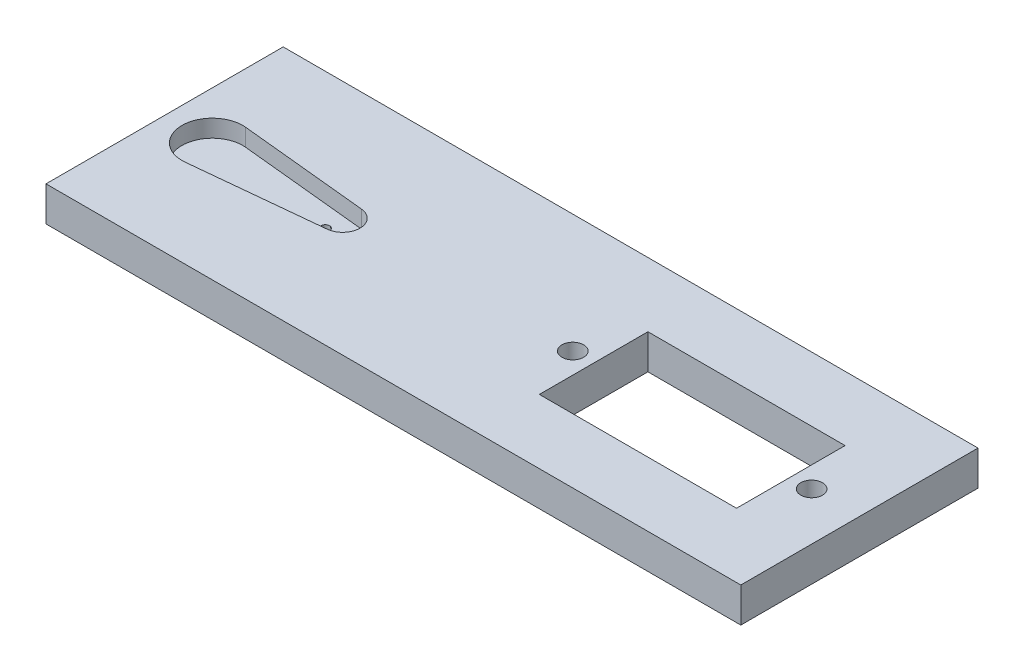
ISO-10303-21;
HEADER;
FILE_DESCRIPTION(('STEP AP214'),'2;1');
FILE_NAME('part.step','',(''),(''),'','','');
FILE_SCHEMA(('AUTOMOTIVE_DESIGN { 1 0 10303 214 1 1 1 1 }'));
ENDSEC;
DATA;
#1=APPLICATION_CONTEXT('core data for automotive mechanical design processes');
#2=APPLICATION_PROTOCOL_DEFINITION('international standard','automotive_design',2000,#1);
#3=PRODUCT_CONTEXT('',#1,'mechanical');
#4=PRODUCT('Part','Part','',(#3));
#5=PRODUCT_RELATED_PRODUCT_CATEGORY('part','',(#4));
#6=PRODUCT_DEFINITION_FORMATION('','',#4);
#7=PRODUCT_DEFINITION_CONTEXT('part definition',#1,'design');
#8=PRODUCT_DEFINITION('design','',#6,#7);
#9=PRODUCT_DEFINITION_SHAPE('','',#8);
#10=(LENGTH_UNIT() NAMED_UNIT(*) SI_UNIT(.MILLI.,.METRE.));
#11=(NAMED_UNIT(*) PLANE_ANGLE_UNIT() SI_UNIT($,.RADIAN.));
#12=(NAMED_UNIT(*) SI_UNIT($,.STERADIAN.) SOLID_ANGLE_UNIT());
#13=UNCERTAINTY_MEASURE_WITH_UNIT(LENGTH_MEASURE(1.E-05),#10,'distance_accuracy_value','');
#14=(GEOMETRIC_REPRESENTATION_CONTEXT(3) GLOBAL_UNCERTAINTY_ASSIGNED_CONTEXT((#13)) GLOBAL_UNIT_ASSIGNED_CONTEXT((#10,
#11,#12)) REPRESENTATION_CONTEXT('',''));
#15=CARTESIAN_POINT('',(0.,0.,0.));
#16=DIRECTION('',(0.,0.,1.));
#17=DIRECTION('',(1.,0.,0.));
#18=AXIS2_PLACEMENT_3D('',#15,#16,#17);
#19=CARTESIAN_POINT('',(0.,4.,-6.25));
#20=DIRECTION('',(0.,0.,-1.));
#21=DIRECTION('',(-1.,0.,0.));
#22=AXIS2_PLACEMENT_3D('',#19,#20,#21);
#23=PLANE('',#22);
#24=DIRECTION('',(1.,0.,0.));
#25=VECTOR('',#24,1.);
#26=CARTESIAN_POINT('',(0.,0.,-6.25));
#27=LINE('',#26,#25);
#28=CARTESIAN_POINT('',(9.40000000000002,0.,-6.25));
#29=VERTEX_POINT('',#28);
#30=CARTESIAN_POINT('',(32.1,0.,-6.25));
#31=VERTEX_POINT('',#30);
#32=EDGE_CURVE('E197',#29,#31,#27,.T.);
#33=ORIENTED_EDGE('',*,*,#32,.T.);
#34=DIRECTION('',(0.,-1.,0.));
#35=VECTOR('',#34,1.);
#36=CARTESIAN_POINT('',(32.1,4.,-6.25));
#37=LINE('',#36,#35);
#38=CARTESIAN_POINT('',(32.1,4.,-6.25));
#39=VERTEX_POINT('',#38);
#40=EDGE_CURVE('E11',#39,#31,#37,.T.);
#41=ORIENTED_EDGE('',*,*,#40,.F.);
#42=DIRECTION('',(1.,0.,0.));
#43=VECTOR('',#42,1.);
#44=CARTESIAN_POINT('',(0.,4.,-6.25));
#45=LINE('',#44,#43);
#46=CARTESIAN_POINT('',(9.40000000000002,4.,-6.25));
#47=VERTEX_POINT('',#46);
#48=EDGE_CURVE('E149',#47,#39,#45,.T.);
#49=ORIENTED_EDGE('',*,*,#48,.F.);
#50=DIRECTION('',(0.,-1.,0.));
#51=VECTOR('',#50,1.);
#52=CARTESIAN_POINT('',(9.40000000000002,4.,-6.25));
#53=LINE('',#52,#51);
#54=EDGE_CURVE('E74',#47,#29,#53,.T.);
#55=ORIENTED_EDGE('',*,*,#54,.T.);
#56=EDGE_LOOP('',(#33,#41,#49,#55));
#57=FACE_BOUND('',#56,.T.);
#58=ADVANCED_FACE('F47',(#57),#23,.F.);
#59=CARTESIAN_POINT('',(32.1,4.,0.));
#60=DIRECTION('',(1.,0.,0.));
#61=DIRECTION('',(0.,0.,-1.));
#62=AXIS2_PLACEMENT_3D('',#59,#60,#61);
#63=PLANE('',#62);
#64=DIRECTION('',(0.,0.,1.));
#65=VECTOR('',#64,1.);
#66=CARTESIAN_POINT('',(32.1,0.,0.));
#67=LINE('',#66,#65);
#68=CARTESIAN_POINT('',(32.1,0.,6.25));
#69=VERTEX_POINT('',#68);
#70=EDGE_CURVE('E156',#31,#69,#67,.T.);
#71=ORIENTED_EDGE('',*,*,#70,.T.);
#72=DIRECTION('',(0.,-1.,0.));
#73=VECTOR('',#72,1.);
#74=CARTESIAN_POINT('',(32.1,4.,6.25));
#75=LINE('',#74,#73);
#76=CARTESIAN_POINT('',(32.1,4.,6.25));
#77=VERTEX_POINT('',#76);
#78=EDGE_CURVE('E57',#77,#69,#75,.T.);
#79=ORIENTED_EDGE('',*,*,#78,.F.);
#80=DIRECTION('',(0.,0.,1.));
#81=VECTOR('',#80,1.);
#82=CARTESIAN_POINT('',(32.1,4.,0.));
#83=LINE('',#82,#81);
#84=EDGE_CURVE('E143',#39,#77,#83,.T.);
#85=ORIENTED_EDGE('',*,*,#84,.F.);
#86=ORIENTED_EDGE('',*,*,#40,.T.);
#87=EDGE_LOOP('',(#71,#79,#85,#86));
#88=FACE_BOUND('',#87,.T.);
#89=ADVANCED_FACE('F155',(#88),#63,.F.);
#90=CARTESIAN_POINT('',(0.,4.,6.25));
#91=DIRECTION('',(0.,0.,-1.));
#92=DIRECTION('',(-1.,0.,0.));
#93=AXIS2_PLACEMENT_3D('',#90,#91,#92);
#94=PLANE('',#93);
#95=DIRECTION('',(1.,0.,0.));
#96=VECTOR('',#95,1.);
#97=CARTESIAN_POINT('',(0.,0.,6.25));
#98=LINE('',#97,#96);
#99=CARTESIAN_POINT('',(9.40000000000002,0.,6.25));
#100=VERTEX_POINT('',#99);
#101=EDGE_CURVE('E202',#100,#69,#98,.T.);
#102=ORIENTED_EDGE('',*,*,#101,.F.);
#103=DIRECTION('',(0.,-1.,0.));
#104=VECTOR('',#103,1.);
#105=CARTESIAN_POINT('',(9.40000000000002,4.,6.25));
#106=LINE('',#105,#104);
#107=CARTESIAN_POINT('',(9.40000000000002,4.,6.25));
#108=VERTEX_POINT('',#107);
#109=EDGE_CURVE('E161',#108,#100,#106,.T.);
#110=ORIENTED_EDGE('',*,*,#109,.F.);
#111=DIRECTION('',(1.,0.,0.));
#112=VECTOR('',#111,1.);
#113=CARTESIAN_POINT('',(0.,4.,6.25));
#114=LINE('',#113,#112);
#115=EDGE_CURVE('E148',#108,#77,#114,.T.);
#116=ORIENTED_EDGE('',*,*,#115,.T.);
#117=ORIENTED_EDGE('',*,*,#78,.T.);
#118=EDGE_LOOP('',(#102,#110,#116,#117));
#119=FACE_BOUND('',#118,.T.);
#120=ADVANCED_FACE('F163',(#119),#94,.T.);
#121=CARTESIAN_POINT('',(40.,4.,0.));
#122=DIRECTION('',(1.,0.,0.));
#123=DIRECTION('',(0.,0.,-1.));
#124=AXIS2_PLACEMENT_3D('',#121,#122,#123);
#125=PLANE('',#124);
#126=DIRECTION('',(0.,0.,1.));
#127=VECTOR('',#126,1.);
#128=CARTESIAN_POINT('',(40.,0.,0.));
#129=LINE('',#128,#127);
#130=CARTESIAN_POINT('',(40.,0.,-13.6546112857514));
#131=VERTEX_POINT('',#130);
#132=CARTESIAN_POINT('',(40.,0.,13.6546112857514));
#133=VERTEX_POINT('',#132);
#134=EDGE_CURVE('E181',#131,#133,#129,.T.);
#135=ORIENTED_EDGE('',*,*,#134,.F.);
#136=DIRECTION('',(0.,-1.,0.));
#137=VECTOR('',#136,1.);
#138=CARTESIAN_POINT('',(40.,4.,-13.6546112857514));
#139=LINE('',#138,#137);
#140=CARTESIAN_POINT('',(40.,4.,-13.6546112857514));
#141=VERTEX_POINT('',#140);
#142=EDGE_CURVE('E212',#141,#131,#139,.T.);
#143=ORIENTED_EDGE('',*,*,#142,.F.);
#144=DIRECTION('',(0.,0.,1.));
#145=VECTOR('',#144,1.);
#146=CARTESIAN_POINT('',(40.,4.,0.));
#147=LINE('',#146,#145);
#148=CARTESIAN_POINT('',(40.,4.,13.6546112857514));
#149=VERTEX_POINT('',#148);
#150=EDGE_CURVE('E288',#141,#149,#147,.T.);
#151=ORIENTED_EDGE('',*,*,#150,.T.);
#152=DIRECTION('',(0.,-1.,0.));
#153=VECTOR('',#152,1.);
#154=CARTESIAN_POINT('',(40.,4.,13.6546112857514));
#155=LINE('',#154,#153);
#156=EDGE_CURVE('E215',#149,#133,#155,.T.);
#157=ORIENTED_EDGE('',*,*,#156,.T.);
#158=EDGE_LOOP('',(#135,#143,#151,#157));
#159=FACE_BOUND('',#158,.T.);
#160=ADVANCED_FACE('F313',(#159),#125,.T.);
#161=CARTESIAN_POINT('',(0.,4.,-13.6546112857514));
#162=DIRECTION('',(0.,0.,-1.));
#163=DIRECTION('',(-1.,0.,0.));
#164=AXIS2_PLACEMENT_3D('',#161,#162,#163);
#165=PLANE('',#164);
#166=DIRECTION('',(1.,0.,0.));
#167=VECTOR('',#166,1.);
#168=CARTESIAN_POINT('',(0.,0.,-13.6546112857514));
#169=LINE('',#168,#167);
#170=CARTESIAN_POINT('',(-40.,0.,-13.6546112857514));
#171=VERTEX_POINT('',#170);
#172=EDGE_CURVE('E185',#171,#131,#169,.T.);
#173=ORIENTED_EDGE('',*,*,#172,.F.);
#174=DIRECTION('',(0.,-1.,0.));
#175=VECTOR('',#174,1.);
#176=CARTESIAN_POINT('',(-40.,4.,-13.6546112857514));
#177=LINE('',#176,#175);
#178=CARTESIAN_POINT('',(-40.,4.,-13.6546112857514));
#179=VERTEX_POINT('',#178);
#180=EDGE_CURVE('E222',#179,#171,#177,.T.);
#181=ORIENTED_EDGE('',*,*,#180,.F.);
#182=DIRECTION('',(1.,0.,0.));
#183=VECTOR('',#182,1.);
#184=CARTESIAN_POINT('',(0.,4.,-13.6546112857514));
#185=LINE('',#184,#183);
#186=EDGE_CURVE('E292',#179,#141,#185,.T.);
#187=ORIENTED_EDGE('',*,*,#186,.T.);
#188=ORIENTED_EDGE('',*,*,#142,.T.);
#189=EDGE_LOOP('',(#173,#181,#187,#188));
#190=FACE_BOUND('',#189,.T.);
#191=ADVANCED_FACE('F316',(#190),#165,.T.);
#192=CARTESIAN_POINT('',(-40.,4.,0.));
#193=DIRECTION('',(1.,0.,0.));
#194=DIRECTION('',(0.,0.,-1.));
#195=AXIS2_PLACEMENT_3D('',#192,#193,#194);
#196=PLANE('',#195);
#197=DIRECTION('',(0.,0.,1.));
#198=VECTOR('',#197,1.);
#199=CARTESIAN_POINT('',(-40.,0.,0.));
#200=LINE('',#199,#198);
#201=CARTESIAN_POINT('',(-40.,0.,13.6546112857514));
#202=VERTEX_POINT('',#201);
#203=EDGE_CURVE('E189',#171,#202,#200,.T.);
#204=ORIENTED_EDGE('',*,*,#203,.T.);
#205=DIRECTION('',(0.,-1.,0.));
#206=VECTOR('',#205,1.);
#207=CARTESIAN_POINT('',(-40.,4.,13.6546112857514));
#208=LINE('',#207,#206);
#209=CARTESIAN_POINT('',(-40.,4.,13.6546112857514));
#210=VERTEX_POINT('',#209);
#211=EDGE_CURVE('E218',#210,#202,#208,.T.);
#212=ORIENTED_EDGE('',*,*,#211,.F.);
#213=DIRECTION('',(0.,0.,1.));
#214=VECTOR('',#213,1.);
#215=CARTESIAN_POINT('',(-40.,4.,0.));
#216=LINE('',#215,#214);
#217=EDGE_CURVE('E296',#179,#210,#216,.T.);
#218=ORIENTED_EDGE('',*,*,#217,.F.);
#219=ORIENTED_EDGE('',*,*,#180,.T.);
#220=EDGE_LOOP('',(#204,#212,#218,#219));
#221=FACE_BOUND('',#220,.T.);
#222=ADVANCED_FACE('F319',(#221),#196,.F.);
#223=CARTESIAN_POINT('',(-19.5,4.,0.));
#224=DIRECTION('',(0.,-1.,0.));
#225=DIRECTION('',(0.,0.,-1.));
#226=AXIS2_PLACEMENT_3D('',#223,#224,#225);
#227=CYLINDRICAL_SURFACE('',#226,2.);
#228=CARTESIAN_POINT('',(-19.5,2.,0.));
#229=DIRECTION('',(0.,1.,0.));
#230=DIRECTION('',(0.,0.,1.));
#231=AXIS2_PLACEMENT_3D('',#228,#229,#230);
#232=CIRCLE('',#231,2.);
#233=CARTESIAN_POINT('',(-19.3,2.,1.98997487421324));
#234=VERTEX_POINT('',#233);
#235=CARTESIAN_POINT('',(-19.3,2.,-1.98997487421324));
#236=VERTEX_POINT('',#235);
#237=EDGE_CURVE('E65',#234,#236,#232,.T.);
#238=ORIENTED_EDGE('',*,*,#237,.F.);
#239=DIRECTION('',(0.,-1.,0.));
#240=VECTOR('',#239,1.);
#241=CARTESIAN_POINT('',(-19.3,4.,1.98997487421324));
#242=LINE('',#241,#240);
#243=CARTESIAN_POINT('',(-19.3,4.,1.98997487421324));
#244=VERTEX_POINT('',#243);
#245=EDGE_CURVE('E51',#244,#234,#242,.T.);
#246=ORIENTED_EDGE('',*,*,#245,.F.);
#247=CARTESIAN_POINT('',(-19.5,4.,0.));
#248=DIRECTION('',(0.,1.,0.));
#249=DIRECTION('',(0.,0.,1.));
#250=AXIS2_PLACEMENT_3D('',#247,#248,#249);
#251=CIRCLE('',#250,2.);
#252=CARTESIAN_POINT('',(-19.3,4.,-1.98997487421324));
#253=VERTEX_POINT('',#252);
#254=EDGE_CURVE('E277',#244,#253,#251,.T.);
#255=ORIENTED_EDGE('',*,*,#254,.T.);
#256=DIRECTION('',(0.,-1.,0.));
#257=VECTOR('',#256,1.);
#258=CARTESIAN_POINT('',(-19.3,4.,-1.98997487421324));
#259=LINE('',#258,#257);
#260=EDGE_CURVE('E168',#253,#236,#259,.T.);
#261=ORIENTED_EDGE('',*,*,#260,.T.);
#262=EDGE_LOOP('',(#238,#246,#255,#261));
#263=FACE_BOUND('',#262,.T.);
#264=ADVANCED_FACE('F353',(#263),#227,.F.);
#265=CARTESIAN_POINT('',(0.00499999999999989,4.,0.0497493718553298));
#266=DIRECTION('',(-0.1,0.,-0.99498743710662));
#267=DIRECTION('',(-0.99498743710662,0.,0.1));
#268=AXIS2_PLACEMENT_3D('',#265,#266,#267);
#269=PLANE('',#268);
#270=DIRECTION('',(0.99498743710662,0.,-0.1));
#271=VECTOR('',#270,1.);
#272=CARTESIAN_POINT('',(0.00499999999999989,2.,0.0497493718553298));
#273=LINE('',#272,#271);
#274=CARTESIAN_POINT('',(-34.15,2.,3.48245602987317));
#275=VERTEX_POINT('',#274);
#276=EDGE_CURVE('E246',#275,#234,#273,.T.);
#277=ORIENTED_EDGE('',*,*,#276,.F.);
#278=DIRECTION('',(0.,-1.,0.));
#279=VECTOR('',#278,1.);
#280=CARTESIAN_POINT('',(-34.15,4.,3.48245602987317));
#281=LINE('',#280,#279);
#282=CARTESIAN_POINT('',(-34.15,4.,3.48245602987317));
#283=VERTEX_POINT('',#282);
#284=EDGE_CURVE('E233',#283,#275,#281,.T.);
#285=ORIENTED_EDGE('',*,*,#284,.F.);
#286=DIRECTION('',(0.99498743710662,0.,-0.1));
#287=VECTOR('',#286,1.);
#288=CARTESIAN_POINT('',(0.00499999999999989,4.,0.0497493718553298));
#289=LINE('',#288,#287);
#290=EDGE_CURVE('E248',#283,#244,#289,.T.);
#291=ORIENTED_EDGE('',*,*,#290,.T.);
#292=ORIENTED_EDGE('',*,*,#245,.T.);
#293=EDGE_LOOP('',(#277,#285,#291,#292));
#294=FACE_BOUND('',#293,.T.);
#295=ADVANCED_FACE('F245',(#294),#269,.T.);
#296=CARTESIAN_POINT('',(-34.5,4.,0.));
#297=DIRECTION('',(0.,-1.,0.));
#298=DIRECTION('',(0.,0.,-1.));
#299=AXIS2_PLACEMENT_3D('',#296,#297,#298);
#300=CYLINDRICAL_SURFACE('',#299,3.5);
#301=CARTESIAN_POINT('',(-34.5,2.,0.));
#302=DIRECTION('',(0.,1.,0.));
#303=DIRECTION('',(0.,0.,1.));
#304=AXIS2_PLACEMENT_3D('',#301,#302,#303);
#305=CIRCLE('',#304,3.5);
#306=CARTESIAN_POINT('',(-34.15,2.,-3.48245602987317));
#307=VERTEX_POINT('',#306);
#308=EDGE_CURVE('E251',#307,#275,#305,.T.);
#309=ORIENTED_EDGE('',*,*,#308,.F.);
#310=DIRECTION('',(0.,-1.,0.));
#311=VECTOR('',#310,1.);
#312=CARTESIAN_POINT('',(-34.15,4.,-3.48245602987317));
#313=LINE('',#312,#311);
#314=CARTESIAN_POINT('',(-34.15,4.,-3.48245602987317));
#315=VERTEX_POINT('',#314);
#316=EDGE_CURVE('E230',#315,#307,#313,.T.);
#317=ORIENTED_EDGE('',*,*,#316,.F.);
#318=CARTESIAN_POINT('',(-34.5,4.,0.));
#319=DIRECTION('',(0.,1.,0.));
#320=DIRECTION('',(0.,0.,1.));
#321=AXIS2_PLACEMENT_3D('',#318,#319,#320);
#322=CIRCLE('',#321,3.5);
#323=EDGE_CURVE('E282',#315,#283,#322,.T.);
#324=ORIENTED_EDGE('',*,*,#323,.T.);
#325=ORIENTED_EDGE('',*,*,#284,.T.);
#326=EDGE_LOOP('',(#309,#317,#324,#325));
#327=FACE_BOUND('',#326,.T.);
#328=ADVANCED_FACE('F350',(#327),#300,.F.);
#329=CARTESIAN_POINT('',(0.,4.,13.6546112857514));
#330=DIRECTION('',(0.,0.,-1.));
#331=DIRECTION('',(-1.,0.,0.));
#332=AXIS2_PLACEMENT_3D('',#329,#330,#331);
#333=PLANE('',#332);
#334=DIRECTION('',(1.,0.,0.));
#335=VECTOR('',#334,1.);
#336=CARTESIAN_POINT('',(0.,0.,13.6546112857514));
#337=LINE('',#336,#335);
#338=EDGE_CURVE('E193',#202,#133,#337,.T.);
#339=ORIENTED_EDGE('',*,*,#338,.T.);
#340=ORIENTED_EDGE('',*,*,#156,.F.);
#341=DIRECTION('',(1.,0.,0.));
#342=VECTOR('',#341,1.);
#343=CARTESIAN_POINT('',(0.,4.,13.6546112857514));
#344=LINE('',#343,#342);
#345=EDGE_CURVE('E300',#210,#149,#344,.T.);
#346=ORIENTED_EDGE('',*,*,#345,.F.);
#347=ORIENTED_EDGE('',*,*,#211,.T.);
#348=EDGE_LOOP('',(#339,#340,#346,#347));
#349=FACE_BOUND('',#348,.T.);
#350=ADVANCED_FACE('F310',(#349),#333,.F.);
#351=CARTESIAN_POINT('',(0.00499999999999989,4.,-0.0497493718553298));
#352=DIRECTION('',(0.1,0.,-0.99498743710662));
#353=DIRECTION('',(-0.99498743710662,0.,-0.1));
#354=AXIS2_PLACEMENT_3D('',#351,#352,#353);
#355=PLANE('',#354);
#356=ORIENTED_EDGE('',*,*,#316,.T.);
#357=DIRECTION('',(0.99498743710662,0.,0.1));
#358=VECTOR('',#357,1.);
#359=CARTESIAN_POINT('',(0.00499999999999989,2.,-0.0497493718553298));
#360=LINE('',#359,#358);
#361=EDGE_CURVE('E177',#307,#236,#360,.T.);
#362=ORIENTED_EDGE('',*,*,#361,.T.);
#363=ORIENTED_EDGE('',*,*,#260,.F.);
#364=DIRECTION('',(0.99498743710662,0.,0.1));
#365=VECTOR('',#364,1.);
#366=CARTESIAN_POINT('',(0.00499999999999989,4.,-0.0497493718553298));
#367=LINE('',#366,#365);
#368=EDGE_CURVE('E285',#315,#253,#367,.T.);
#369=ORIENTED_EDGE('',*,*,#368,.F.);
#370=EDGE_LOOP('',(#356,#362,#363,#369));
#371=FACE_BOUND('',#370,.T.);
#372=ADVANCED_FACE('F349',(#371),#355,.F.);
#373=CARTESIAN_POINT('',(7.00000000000001,4.,0.));
#374=DIRECTION('',(0.,-1.,0.));
#375=DIRECTION('',(0.,0.,-1.));
#376=AXIS2_PLACEMENT_3D('',#373,#374,#375);
#377=CYLINDRICAL_SURFACE('',#376,1.25);
#378=CARTESIAN_POINT('',(7.00000000000001,4.,0.));
#379=DIRECTION('',(0.,1.,0.));
#380=DIRECTION('',(0.,0.,1.));
#381=AXIS2_PLACEMENT_3D('',#378,#379,#380);
#382=CIRCLE('',#381,1.25);
#383=CARTESIAN_POINT('',(7.00000000000001,4.,1.25));
#384=VERTEX_POINT('',#383);
#385=EDGE_CURVE('E273',#384,#384,#382,.T.);
#386=ORIENTED_EDGE('',*,*,#385,.T.);
#387=EDGE_LOOP('',(#386));
#388=FACE_BOUND('',#387,.T.);
#389=CARTESIAN_POINT('',(7.00000000000001,0.,0.));
#390=DIRECTION('',(0.,1.,0.));
#391=DIRECTION('',(0.,0.,1.));
#392=AXIS2_PLACEMENT_3D('',#389,#390,#391);
#393=CIRCLE('',#392,1.25);
#394=CARTESIAN_POINT('',(7.00000000000001,0.,1.25));
#395=VERTEX_POINT('',#394);
#396=EDGE_CURVE('E176',#395,#395,#393,.T.);
#397=ORIENTED_EDGE('',*,*,#396,.F.);
#398=EDGE_LOOP('',(#397));
#399=FACE_BOUND('',#398,.T.);
#400=ADVANCED_FACE('F360',(#388,#399),#377,.F.);
#401=CARTESIAN_POINT('',(34.5,4.,0.));
#402=DIRECTION('',(0.,-1.,0.));
#403=DIRECTION('',(0.,0.,-1.));
#404=AXIS2_PLACEMENT_3D('',#401,#402,#403);
#405=CYLINDRICAL_SURFACE('',#404,1.25);
#406=CARTESIAN_POINT('',(34.5,4.,0.));
#407=DIRECTION('',(0.,1.,0.));
#408=DIRECTION('',(0.,0.,1.));
#409=AXIS2_PLACEMENT_3D('',#406,#407,#408);
#410=CIRCLE('',#409,1.25);
#411=CARTESIAN_POINT('',(34.5,4.,1.25));
#412=VERTEX_POINT('',#411);
#413=EDGE_CURVE('E209',#412,#412,#410,.T.);
#414=ORIENTED_EDGE('',*,*,#413,.T.);
#415=EDGE_LOOP('',(#414));
#416=FACE_BOUND('',#415,.T.);
#417=CARTESIAN_POINT('',(34.5,0.,0.));
#418=DIRECTION('',(0.,1.,0.));
#419=DIRECTION('',(0.,0.,1.));
#420=AXIS2_PLACEMENT_3D('',#417,#418,#419);
#421=CIRCLE('',#420,1.25);
#422=CARTESIAN_POINT('',(34.5,0.,1.25));
#423=VERTEX_POINT('',#422);
#424=EDGE_CURVE('E172',#423,#423,#421,.T.);
#425=ORIENTED_EDGE('',*,*,#424,.F.);
#426=EDGE_LOOP('',(#425));
#427=FACE_BOUND('',#426,.T.);
#428=ADVANCED_FACE('F49',(#416,#427),#405,.F.);
#429=CARTESIAN_POINT('',(9.40000000000002,4.,0.));
#430=DIRECTION('',(1.,0.,0.));
#431=DIRECTION('',(0.,0.,-1.));
#432=AXIS2_PLACEMENT_3D('',#429,#430,#431);
#433=PLANE('',#432);
#434=DIRECTION('',(0.,0.,1.));
#435=VECTOR('',#434,1.);
#436=CARTESIAN_POINT('',(9.40000000000002,0.,0.));
#437=LINE('',#436,#435);
#438=EDGE_CURVE('E205',#29,#100,#437,.T.);
#439=ORIENTED_EDGE('',*,*,#438,.F.);
#440=ORIENTED_EDGE('',*,*,#54,.F.);
#441=DIRECTION('',(0.,0.,1.));
#442=VECTOR('',#441,1.);
#443=CARTESIAN_POINT('',(9.40000000000002,4.,0.));
#444=LINE('',#443,#442);
#445=EDGE_CURVE('E165',#47,#108,#444,.T.);
#446=ORIENTED_EDGE('',*,*,#445,.T.);
#447=ORIENTED_EDGE('',*,*,#109,.T.);
#448=EDGE_LOOP('',(#439,#440,#446,#447));
#449=FACE_BOUND('',#448,.T.);
#450=ADVANCED_FACE('F372',(#449),#433,.T.);
#451=CARTESIAN_POINT('',(0.,4.,0.));
#452=DIRECTION('',(0.,1.,0.));
#453=DIRECTION('',(0.,0.,1.));
#454=AXIS2_PLACEMENT_3D('',#451,#452,#453);
#455=PLANE('',#454);
#456=ORIENTED_EDGE('',*,*,#413,.F.);
#457=EDGE_LOOP('',(#456));
#458=FACE_BOUND('',#457,.T.);
#459=ORIENTED_EDGE('',*,*,#385,.F.);
#460=EDGE_LOOP('',(#459));
#461=FACE_BOUND('',#460,.T.);
#462=ORIENTED_EDGE('',*,*,#254,.F.);
#463=ORIENTED_EDGE('',*,*,#290,.F.);
#464=ORIENTED_EDGE('',*,*,#323,.F.);
#465=ORIENTED_EDGE('',*,*,#368,.T.);
#466=EDGE_LOOP('',(#462,#463,#464,#465));
#467=FACE_BOUND('',#466,.T.);
#468=ORIENTED_EDGE('',*,*,#150,.F.);
#469=ORIENTED_EDGE('',*,*,#186,.F.);
#470=ORIENTED_EDGE('',*,*,#217,.T.);
#471=ORIENTED_EDGE('',*,*,#345,.T.);
#472=EDGE_LOOP('',(#468,#469,#470,#471));
#473=FACE_BOUND('',#472,.T.);
#474=ORIENTED_EDGE('',*,*,#48,.T.);
#475=ORIENTED_EDGE('',*,*,#84,.T.);
#476=ORIENTED_EDGE('',*,*,#115,.F.);
#477=ORIENTED_EDGE('',*,*,#445,.F.);
#478=EDGE_LOOP('',(#474,#475,#476,#477));
#479=FACE_BOUND('',#478,.T.);
#480=ADVANCED_FACE('F145',(#458,#461,#467,#473,#479),#455,.T.);
#481=CARTESIAN_POINT('',(0.,0.,0.));
#482=DIRECTION('',(0.,1.,0.));
#483=DIRECTION('',(0.,0.,1.));
#484=AXIS2_PLACEMENT_3D('',#481,#482,#483);
#485=PLANE('',#484);
#486=ORIENTED_EDGE('',*,*,#424,.T.);
#487=EDGE_LOOP('',(#486));
#488=FACE_BOUND('',#487,.T.);
#489=ORIENTED_EDGE('',*,*,#396,.T.);
#490=EDGE_LOOP('',(#489));
#491=FACE_BOUND('',#490,.T.);
#492=ORIENTED_EDGE('',*,*,#134,.T.);
#493=ORIENTED_EDGE('',*,*,#338,.F.);
#494=ORIENTED_EDGE('',*,*,#203,.F.);
#495=ORIENTED_EDGE('',*,*,#172,.T.);
#496=EDGE_LOOP('',(#492,#493,#494,#495));
#497=FACE_BOUND('',#496,.T.);
#498=ORIENTED_EDGE('',*,*,#32,.F.);
#499=ORIENTED_EDGE('',*,*,#438,.T.);
#500=ORIENTED_EDGE('',*,*,#101,.T.);
#501=ORIENTED_EDGE('',*,*,#70,.F.);
#502=EDGE_LOOP('',(#498,#499,#500,#501));
#503=FACE_BOUND('',#502,.T.);
#504=CARTESIAN_POINT('',(-21.5,0.,0.));
#505=DIRECTION('',(0.,1.,0.));
#506=DIRECTION('',(0.,0.,1.));
#507=AXIS2_PLACEMENT_3D('',#504,#505,#506);
#508=CIRCLE('',#507,0.499999999999999);
#509=CARTESIAN_POINT('',(-21.5,0.,0.499999999999999));
#510=VERTEX_POINT('',#509);
#511=EDGE_CURVE('E260',#510,#510,#508,.T.);
#512=ORIENTED_EDGE('',*,*,#511,.T.);
#513=EDGE_LOOP('',(#512));
#514=FACE_BOUND('',#513,.T.);
#515=ADVANCED_FACE('F321',(#488,#491,#497,#503,#514),#485,.F.);
#516=CARTESIAN_POINT('',(-21.5,2.,0.));
#517=DIRECTION('',(0.,-1.,0.));
#518=DIRECTION('',(0.,0.,-1.));
#519=AXIS2_PLACEMENT_3D('',#516,#517,#518);
#520=CYLINDRICAL_SURFACE('',#519,0.499999999999999);
#521=CARTESIAN_POINT('',(-21.5,2.,0.));
#522=DIRECTION('',(0.,1.,0.));
#523=DIRECTION('',(0.,0.,1.));
#524=AXIS2_PLACEMENT_3D('',#521,#522,#523);
#525=CIRCLE('',#524,0.499999999999999);
#526=CARTESIAN_POINT('',(-21.5,2.,0.499999999999999));
#527=VERTEX_POINT('',#526);
#528=EDGE_CURVE('E254',#527,#527,#525,.T.);
#529=ORIENTED_EDGE('',*,*,#528,.T.);
#530=EDGE_LOOP('',(#529));
#531=FACE_BOUND('',#530,.T.);
#532=ORIENTED_EDGE('',*,*,#511,.F.);
#533=EDGE_LOOP('',(#532));
#534=FACE_BOUND('',#533,.T.);
#535=ADVANCED_FACE('F324',(#531,#534),#520,.F.);
#536=CARTESIAN_POINT('',(0.,2.,0.));
#537=DIRECTION('',(0.,1.,0.));
#538=DIRECTION('',(0.,0.,1.));
#539=AXIS2_PLACEMENT_3D('',#536,#537,#538);
#540=PLANE('',#539);
#541=ORIENTED_EDGE('',*,*,#528,.F.);
#542=EDGE_LOOP('',(#541));
#543=FACE_BOUND('',#542,.T.);
#544=ORIENTED_EDGE('',*,*,#308,.T.);
#545=ORIENTED_EDGE('',*,*,#276,.T.);
#546=ORIENTED_EDGE('',*,*,#237,.T.);
#547=ORIENTED_EDGE('',*,*,#361,.F.);
#548=EDGE_LOOP('',(#544,#545,#546,#547));
#549=FACE_BOUND('',#548,.T.);
#550=ADVANCED_FACE('F252',(#543,#549),#540,.T.);
#551=CLOSED_SHELL('',(#58,#89,#120,#160,#191,#222,#264,#295,#328,#350,#372,#400,#428,#450,#480,
#515,#535,#550));
#552=MANIFOLD_SOLID_BREP('B2',#551);
#553=ADVANCED_BREP_SHAPE_REPRESENTATION('',(#18,#552),#14);
#554=SHAPE_DEFINITION_REPRESENTATION(#9,#553);
ENDSEC;
END-ISO-10303-21;
